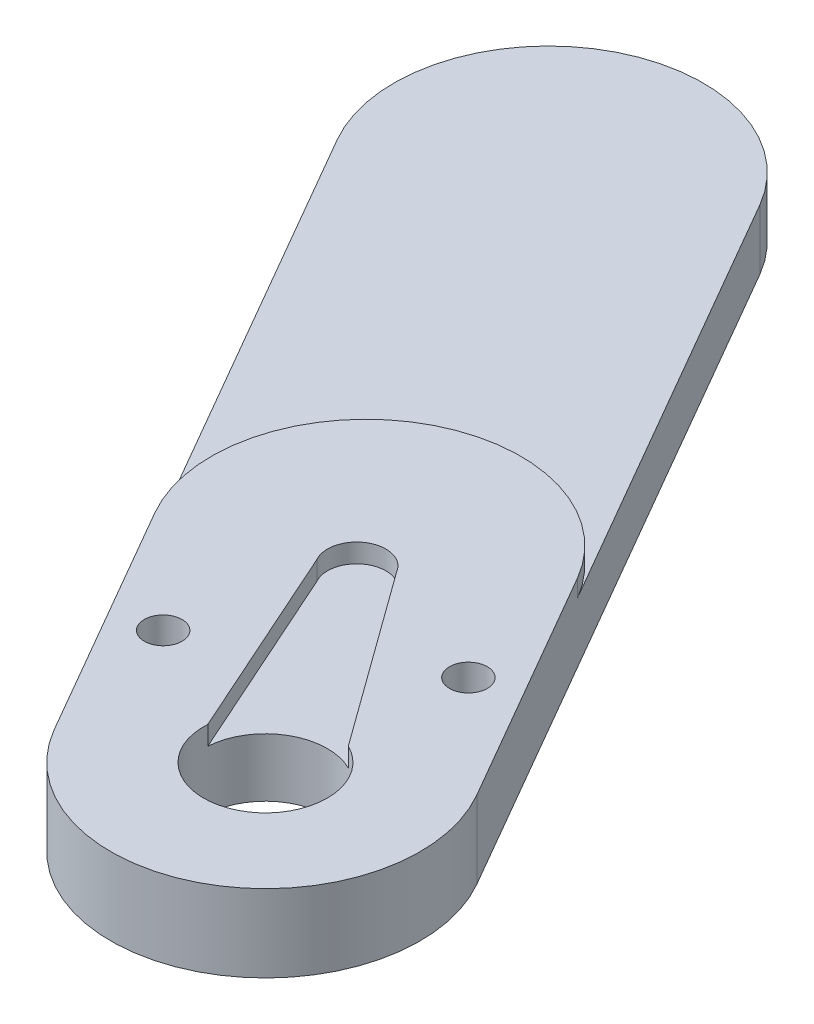
ISO-10303-21;
HEADER;
FILE_DESCRIPTION(('STEP AP214'),'2;1');
FILE_NAME('part.step','',(''),(''),'','','');
FILE_SCHEMA(('AUTOMOTIVE_DESIGN { 1 0 10303 214 1 1 1 1 }'));
ENDSEC;
DATA;
#1=APPLICATION_CONTEXT('core data for automotive mechanical design processes');
#2=APPLICATION_PROTOCOL_DEFINITION('international standard','automotive_design',2000,#1);
#3=PRODUCT_CONTEXT('',#1,'mechanical');
#4=PRODUCT('Part','Part','',(#3));
#5=PRODUCT_RELATED_PRODUCT_CATEGORY('part','',(#4));
#6=PRODUCT_DEFINITION_FORMATION('','',#4);
#7=PRODUCT_DEFINITION_CONTEXT('part definition',#1,'design');
#8=PRODUCT_DEFINITION('design','',#6,#7);
#9=PRODUCT_DEFINITION_SHAPE('','',#8);
#10=(LENGTH_UNIT() NAMED_UNIT(*) SI_UNIT(.MILLI.,.METRE.));
#11=(NAMED_UNIT(*) PLANE_ANGLE_UNIT() SI_UNIT($,.RADIAN.));
#12=(NAMED_UNIT(*) SI_UNIT($,.STERADIAN.) SOLID_ANGLE_UNIT());
#13=UNCERTAINTY_MEASURE_WITH_UNIT(LENGTH_MEASURE(1.E-05),#10,'distance_accuracy_value','');
#14=(GEOMETRIC_REPRESENTATION_CONTEXT(3) GLOBAL_UNCERTAINTY_ASSIGNED_CONTEXT((#13)) GLOBAL_UNIT_ASSIGNED_CONTEXT((#10,
#11,#12)) REPRESENTATION_CONTEXT('',''));
#15=CARTESIAN_POINT('',(0.,0.,0.));
#16=DIRECTION('',(0.,0.,1.));
#17=DIRECTION('',(1.,0.,0.));
#18=AXIS2_PLACEMENT_3D('',#15,#16,#17);
#19=CARTESIAN_POINT('',(59.654169994804,-70.1,-40.43616371386));
#20=DIRECTION('',(0.,1.,0.));
#21=DIRECTION('',(1.,0.,0.));
#22=AXIS2_PLACEMENT_3D('',#19,#20,#21);
#23=PLANE('',#22);
#24=CARTESIAN_POINT('',(63.,-70.1,-34.64101615137));
#25=DIRECTION('',(0.,1.,0.));
#26=DIRECTION('',(-0.50000000000019,0.,-0.866025403784329));
#27=AXIS2_PLACEMENT_3D('',#24,#25,#26);
#28=CIRCLE('',#27,3.6);
#29=CARTESIAN_POINT('',(64.591871397493,-70.1,-37.86993941677));
#30=VERTEX_POINT('',#29);
#31=CARTESIAN_POINT('',(61.2,-70.1,-37.758707605));
#32=VERTEX_POINT('',#31);
#33=EDGE_CURVE('E44',#30,#32,#28,.T.);
#34=ORIENTED_EDGE('',*,*,#33,.F.);
#35=DIRECTION('',(0.586459175781039,0.,0.809978786847054));
#36=VECTOR('',#35,1.);
#37=CARTESIAN_POINT('',(57.222243186434,-70.1,-48.04838450625));
#38=LINE('',#37,#36);
#39=CARTESIAN_POINT('',(57.222243186434,-70.1,-48.04838450625));
#40=VERTEX_POINT('',#39);
#41=EDGE_CURVE('E25',#40,#30,#38,.T.);
#42=ORIENTED_EDGE('',*,*,#41,.F.);
#43=CARTESIAN_POINT('',(55.75,-70.1,-47.19838450625));
#44=DIRECTION('',(0.,1.,0.));
#45=DIRECTION('',(0.866025403784329,0.,-0.50000000000019));
#46=AXIS2_PLACEMENT_3D('',#43,#44,#45);
#47=CIRCLE('',#46,1.7);
#48=CARTESIAN_POINT('',(54.277756813566,-70.1,-46.34838450625));
#49=VERTEX_POINT('',#48);
#50=EDGE_CURVE('E244',#40,#49,#47,.T.);
#51=ORIENTED_EDGE('',*,*,#50,.T.);
#52=DIRECTION('',(-0.408232618045233,0.,-0.912877937932522));
#53=VECTOR('',#52,1.);
#54=CARTESIAN_POINT('',(60.22871870789,-70.1,-33.04101615137));
#55=LINE('',#54,#53);
#56=CARTESIAN_POINT('',(59.407734726546,-70.1,-34.87687671429));
#57=VERTEX_POINT('',#56);
#58=EDGE_CURVE('E241',#57,#49,#55,.T.);
#59=ORIENTED_EDGE('',*,*,#58,.F.);
#60=CARTESIAN_POINT('',(63.,-70.1,-34.64101615137));
#61=DIRECTION('',(0.,1.,0.));
#62=DIRECTION('',(-0.50000000000019,0.,-0.866025403784329));
#63=AXIS2_PLACEMENT_3D('',#60,#61,#62);
#64=CIRCLE('',#63,3.6);
#65=EDGE_CURVE('E254',#32,#57,#64,.T.);
#66=ORIENTED_EDGE('',*,*,#65,.F.);
#67=EDGE_LOOP('',(#34,#42,#51,#59,#66));
#68=FACE_BOUND('',#67,.T.);
#69=ADVANCED_FACE('F16',(#68),#23,.T.);
#70=CARTESIAN_POINT('',(64.629165124599,-73.7,-44.81921938165));
#71=DIRECTION('',(0.,-1.,0.));
#72=DIRECTION('',(-0.50000000000019,0.,-0.866025403784329));
#73=AXIS2_PLACEMENT_3D('',#70,#71,#72);
#74=CYLINDRICAL_SURFACE('',#73,1.1);
#75=DIRECTION('',(0.,1.,0.));
#76=VECTOR('',#75,1.);
#77=CARTESIAN_POINT('',(64.079165124599,-73.7,-45.77184732581));
#78=LINE('',#77,#76);
#79=CARTESIAN_POINT('',(64.079165124599,-73.5,-45.77184732581));
#80=VERTEX_POINT('',#79);
#81=CARTESIAN_POINT('',(64.079165124599,-69.,-45.77184732581));
#82=VERTEX_POINT('',#81);
#83=EDGE_CURVE('E11',#80,#82,#78,.T.);
#84=ORIENTED_EDGE('',*,*,#83,.T.);
#85=CARTESIAN_POINT('',(64.629165124599,-69.,-44.81921938165));
#86=DIRECTION('',(0.,1.,0.));
#87=DIRECTION('',(-0.50000000000019,0.,-0.866025403784329));
#88=AXIS2_PLACEMENT_3D('',#85,#86,#87);
#89=CIRCLE('',#88,1.1);
#90=EDGE_CURVE('E194',#82,#82,#89,.T.);
#91=ORIENTED_EDGE('',*,*,#90,.T.);
#92=ORIENTED_EDGE('',*,*,#83,.F.);
#93=CARTESIAN_POINT('',(64.629165124599,-73.5,-44.81921938165));
#94=DIRECTION('',(0.,1.,0.));
#95=DIRECTION('',(-0.50000000000019,0.,-0.866025403784329));
#96=AXIS2_PLACEMENT_3D('',#93,#94,#95);
#97=CIRCLE('',#96,1.1);
#98=EDGE_CURVE('E228',#80,#80,#97,.T.);
#99=ORIENTED_EDGE('',*,*,#98,.F.);
#100=EDGE_LOOP('',(#84,#91,#92,#99));
#101=FACE_BOUND('',#100,.T.);
#102=ADVANCED_FACE('F428',(#101),#74,.F.);
#103=CARTESIAN_POINT('',(57.222243186434,-70.1,-48.04838450625));
#104=DIRECTION('',(-0.809978786847054,0.,0.586459175781039));
#105=DIRECTION('',(0.,1.,0.));
#106=AXIS2_PLACEMENT_3D('',#103,#104,#105);
#107=PLANE('',#106);
#108=DIRECTION('',(0.,-1.,0.));
#109=VECTOR('',#108,1.);
#110=CARTESIAN_POINT('',(64.591871397493,-73.6,-37.86993941677));
#111=LINE('',#110,#109);
#112=CARTESIAN_POINT('',(64.591871397493,-69.,-37.86993941677));
#113=VERTEX_POINT('',#112);
#114=EDGE_CURVE('E256',#113,#30,#111,.T.);
#115=ORIENTED_EDGE('',*,*,#114,.F.);
#116=DIRECTION('',(-0.586459175781039,0.,-0.809978786847054));
#117=VECTOR('',#116,1.);
#118=CARTESIAN_POINT('',(59.066823878882,-69.,-45.50077114591));
#119=LINE('',#118,#117);
#120=CARTESIAN_POINT('',(57.222243186434,-69.,-48.04838450625));
#121=VERTEX_POINT('',#120);
#122=EDGE_CURVE('E186',#113,#121,#119,.T.);
#123=ORIENTED_EDGE('',*,*,#122,.T.);
#124=DIRECTION('',(0.,1.,0.));
#125=VECTOR('',#124,1.);
#126=CARTESIAN_POINT('',(57.222243186434,-70.1,-48.04838450625));
#127=LINE('',#126,#125);
#128=EDGE_CURVE('E248',#40,#121,#127,.T.);
#129=ORIENTED_EDGE('',*,*,#128,.F.);
#130=ORIENTED_EDGE('',*,*,#41,.T.);
#131=EDGE_LOOP('',(#115,#123,#129,#130));
#132=FACE_BOUND('',#131,.T.);
#133=ADVANCED_FACE('F18',(#132),#107,.T.);
#134=CARTESIAN_POINT('',(63.,-73.6,-34.64101615137));
#135=DIRECTION('',(0.,-1.,0.));
#136=DIRECTION('',(-0.50000000000019,0.,-0.866025403784329));
#137=AXIS2_PLACEMENT_3D('',#134,#135,#136);
#138=CYLINDRICAL_SURFACE('',#137,3.6);
#139=DIRECTION('',(0.,1.,0.));
#140=VECTOR('',#139,1.);
#141=CARTESIAN_POINT('',(61.2,-73.6,-37.758707605));
#142=LINE('',#141,#140);
#143=CARTESIAN_POINT('',(61.2,-73.5,-37.758707605));
#144=VERTEX_POINT('',#143);
#145=EDGE_CURVE('E253',#144,#32,#142,.T.);
#146=ORIENTED_EDGE('',*,*,#145,.T.);
#147=ORIENTED_EDGE('',*,*,#65,.T.);
#148=DIRECTION('',(0.,-1.,0.));
#149=VECTOR('',#148,1.);
#150=CARTESIAN_POINT('',(59.407734726546,-73.6,-34.87687671429));
#151=LINE('',#150,#149);
#152=CARTESIAN_POINT('',(59.407734726546,-69.,-34.87687671429));
#153=VERTEX_POINT('',#152);
#154=EDGE_CURVE('E236',#153,#57,#151,.T.);
#155=ORIENTED_EDGE('',*,*,#154,.F.);
#156=CARTESIAN_POINT('',(63.,-69.,-34.64101615137));
#157=DIRECTION('',(0.,1.,0.));
#158=DIRECTION('',(-0.50000000000019,0.,-0.866025403784329));
#159=AXIS2_PLACEMENT_3D('',#156,#157,#158);
#160=CIRCLE('',#159,3.6);
#161=EDGE_CURVE('E189',#153,#113,#160,.T.);
#162=ORIENTED_EDGE('',*,*,#161,.T.);
#163=ORIENTED_EDGE('',*,*,#114,.T.);
#164=ORIENTED_EDGE('',*,*,#33,.T.);
#165=ORIENTED_EDGE('',*,*,#145,.F.);
#166=CARTESIAN_POINT('',(63.,-73.5,-34.64101615137));
#167=DIRECTION('',(0.,1.,0.));
#168=DIRECTION('',(-0.50000000000019,0.,-0.866025403784329));
#169=AXIS2_PLACEMENT_3D('',#166,#167,#168);
#170=CIRCLE('',#169,3.6);
#171=EDGE_CURVE('E223',#144,#144,#170,.T.);
#172=ORIENTED_EDGE('',*,*,#171,.F.);
#173=EDGE_LOOP('',(#146,#147,#155,#162,#163,#164,#165,#172));
#174=FACE_BOUND('',#173,.T.);
#175=ADVANCED_FACE('F461',(#174),#138,.F.);
#176=CARTESIAN_POINT('',(55.75,-70.1,-47.19838450625));
#177=DIRECTION('',(0.,-1.,0.));
#178=DIRECTION('',(-0.50000000000019,0.,-0.866025403784329));
#179=AXIS2_PLACEMENT_3D('',#176,#177,#178);
#180=CYLINDRICAL_SURFACE('',#179,1.7);
#181=CARTESIAN_POINT('',(55.75,-69.,-47.19838450625));
#182=DIRECTION('',(0.,1.,0.));
#183=DIRECTION('',(-0.50000000000019,0.,-0.866025403784329));
#184=AXIS2_PLACEMENT_3D('',#181,#182,#183);
#185=CIRCLE('',#184,1.7);
#186=CARTESIAN_POINT('',(54.277756813566,-69.,-46.34838450625));
#187=VERTEX_POINT('',#186);
#188=EDGE_CURVE('E184',#121,#187,#185,.T.);
#189=ORIENTED_EDGE('',*,*,#188,.T.);
#190=DIRECTION('',(0.,1.,0.));
#191=VECTOR('',#190,1.);
#192=CARTESIAN_POINT('',(54.277756813566,-70.1,-46.34838450625));
#193=LINE('',#192,#191);
#194=EDGE_CURVE('E232',#49,#187,#193,.T.);
#195=ORIENTED_EDGE('',*,*,#194,.F.);
#196=ORIENTED_EDGE('',*,*,#50,.F.);
#197=ORIENTED_EDGE('',*,*,#128,.T.);
#198=EDGE_LOOP('',(#189,#195,#196,#197));
#199=FACE_BOUND('',#198,.T.);
#200=ADVANCED_FACE('F445',(#199),#180,.F.);
#201=CARTESIAN_POINT('',(60.22871870789,-70.1,-33.04101615137));
#202=DIRECTION('',(0.912877937932522,0.,-0.408232618045233));
#203=DIRECTION('',(0.,-1.,0.));
#204=AXIS2_PLACEMENT_3D('',#201,#202,#203);
#205=PLANE('',#204);
#206=ORIENTED_EDGE('',*,*,#194,.T.);
#207=DIRECTION('',(0.408232618045233,0.,0.912877937932522));
#208=VECTOR('',#207,1.);
#209=CARTESIAN_POINT('',(58.537245303574,-69.,-36.82343990965));
#210=LINE('',#209,#208);
#211=EDGE_CURVE('E191',#187,#153,#210,.T.);
#212=ORIENTED_EDGE('',*,*,#211,.T.);
#213=ORIENTED_EDGE('',*,*,#154,.T.);
#214=ORIENTED_EDGE('',*,*,#58,.T.);
#215=EDGE_LOOP('',(#206,#212,#213,#214));
#216=FACE_BOUND('',#215,.T.);
#217=ADVANCED_FACE('F437',(#216),#205,.T.);
#218=CARTESIAN_POINT('',(53.370834875401,-73.7,-38.31921938165));
#219=DIRECTION('',(0.,-1.,0.));
#220=DIRECTION('',(-0.50000000000019,0.,-0.866025403784329));
#221=AXIS2_PLACEMENT_3D('',#218,#219,#220);
#222=CYLINDRICAL_SURFACE('',#221,1.1);
#223=DIRECTION('',(0.,1.,0.));
#224=VECTOR('',#223,1.);
#225=CARTESIAN_POINT('',(52.820834875401,-73.7,-39.27184732581));
#226=LINE('',#225,#224);
#227=CARTESIAN_POINT('',(52.820834875401,-73.5,-39.27184732581));
#228=VERTEX_POINT('',#227);
#229=CARTESIAN_POINT('',(52.820834875401,-69.,-39.27184732581));
#230=VERTEX_POINT('',#229);
#231=EDGE_CURVE('E233',#228,#230,#226,.T.);
#232=ORIENTED_EDGE('',*,*,#231,.T.);
#233=CARTESIAN_POINT('',(53.370834875401,-69.,-38.31921938165));
#234=DIRECTION('',(0.,1.,0.));
#235=DIRECTION('',(-0.50000000000019,0.,-0.866025403784329));
#236=AXIS2_PLACEMENT_3D('',#233,#234,#235);
#237=CIRCLE('',#236,1.1);
#238=EDGE_CURVE('E179',#230,#230,#237,.T.);
#239=ORIENTED_EDGE('',*,*,#238,.T.);
#240=ORIENTED_EDGE('',*,*,#231,.F.);
#241=CARTESIAN_POINT('',(53.370834875401,-73.5,-38.31921938165));
#242=DIRECTION('',(0.,1.,0.));
#243=DIRECTION('',(-0.50000000000019,0.,-0.866025403784329));
#244=AXIS2_PLACEMENT_3D('',#241,#242,#243);
#245=CIRCLE('',#244,1.1);
#246=EDGE_CURVE('E222',#228,#228,#245,.T.);
#247=ORIENTED_EDGE('',*,*,#246,.F.);
#248=EDGE_LOOP('',(#232,#239,#240,#247));
#249=FACE_BOUND('',#248,.T.);
#250=ADVANCED_FACE('F442',(#249),#222,.F.);
#251=CARTESIAN_POINT('',(48.29422863406,-73.5,-78.11215932167));
#252=DIRECTION('',(-0.866025403784329,0.,0.50000000000019));
#253=DIRECTION('',(0.,1.,0.));
#254=AXIS2_PLACEMENT_3D('',#251,#252,#253);
#255=PLANE('',#254);
#256=DIRECTION('',(0.,1.,0.));
#257=VECTOR('',#256,1.);
#258=CARTESIAN_POINT('',(48.29422863406,-73.5,-78.11215932167));
#259=LINE('',#258,#257);
#260=CARTESIAN_POINT('',(48.29422863406,-73.5,-78.11215932167));
#261=VERTEX_POINT('',#260);
#262=CARTESIAN_POINT('',(48.29422863406,-70.,-78.11215932167));
#263=VERTEX_POINT('',#262);
#264=EDGE_CURVE('E211',#261,#263,#259,.T.);
#265=ORIENTED_EDGE('',*,*,#264,.T.);
#266=DIRECTION('',(0.50000000000019,0.,0.866025403784329));
#267=VECTOR('',#266,1.);
#268=CARTESIAN_POINT('',(48.29422863406,-70.,-78.11215932167));
#269=LINE('',#268,#267);
#270=CARTESIAN_POINT('',(62.79422863406,-70.,-52.99742261192));
#271=VERTEX_POINT('',#270);
#272=EDGE_CURVE('E202',#263,#271,#269,.T.);
#273=ORIENTED_EDGE('',*,*,#272,.T.);
#274=DIRECTION('',(0.,1.,0.));
#275=VECTOR('',#274,1.);
#276=CARTESIAN_POINT('',(62.79422863406,-70.,-52.99742261192));
#277=LINE('',#276,#275);
#278=CARTESIAN_POINT('',(62.79422863406,-69.,-52.99742261192));
#279=VERTEX_POINT('',#278);
#280=EDGE_CURVE('E149',#271,#279,#277,.T.);
#281=ORIENTED_EDGE('',*,*,#280,.T.);
#282=DIRECTION('',(0.50000000000019,0.,0.866025403784329));
#283=VECTOR('',#282,1.);
#284=CARTESIAN_POINT('',(62.79422863406,-69.,-52.99742261192));
#285=LINE('',#284,#283);
#286=CARTESIAN_POINT('',(70.79422863406,-69.,-39.14101615137));
#287=VERTEX_POINT('',#286);
#288=EDGE_CURVE('E142',#279,#287,#285,.T.);
#289=ORIENTED_EDGE('',*,*,#288,.T.);
#290=DIRECTION('',(0.,-1.,0.));
#291=VECTOR('',#290,1.);
#292=CARTESIAN_POINT('',(70.79422863406,-69.,-39.14101615137));
#293=LINE('',#292,#291);
#294=CARTESIAN_POINT('',(70.79422863406,-73.5,-39.14101615137));
#295=VERTEX_POINT('',#294);
#296=EDGE_CURVE('E148',#287,#295,#293,.T.);
#297=ORIENTED_EDGE('',*,*,#296,.T.);
#298=DIRECTION('',(0.50000000000019,0.,0.866025403784329));
#299=VECTOR('',#298,1.);
#300=CARTESIAN_POINT('',(48.29422863406,-73.5,-78.11215932167));
#301=LINE('',#300,#299);
#302=EDGE_CURVE('E217',#261,#295,#301,.T.);
#303=ORIENTED_EDGE('',*,*,#302,.F.);
#304=EDGE_LOOP('',(#265,#273,#281,#289,#297,#303));
#305=FACE_BOUND('',#304,.T.);
#306=ADVANCED_FACE('F145',(#305),#255,.F.);
#307=CARTESIAN_POINT('',(51.75,-73.5,-54.12658773652));
#308=DIRECTION('',(0.,1.,0.));
#309=DIRECTION('',(1.,0.,0.));
#310=AXIS2_PLACEMENT_3D('',#307,#308,#309);
#311=PLANE('',#310);
#312=ORIENTED_EDGE('',*,*,#98,.T.);
#313=EDGE_LOOP('',(#312));
#314=FACE_BOUND('',#313,.T.);
#315=ORIENTED_EDGE('',*,*,#171,.T.);
#316=EDGE_LOOP('',(#315));
#317=FACE_BOUND('',#316,.T.);
#318=ORIENTED_EDGE('',*,*,#246,.T.);
#319=EDGE_LOOP('',(#318));
#320=FACE_BOUND('',#319,.T.);
#321=DIRECTION('',(-0.50000000000019,0.,-0.866025403784329));
#322=VECTOR('',#321,1.);
#323=CARTESIAN_POINT('',(55.20577136594,-73.5,-30.14101615137));
#324=LINE('',#323,#322);
#325=CARTESIAN_POINT('',(55.20577136594,-73.5,-30.14101615137));
#326=VERTEX_POINT('',#325);
#327=CARTESIAN_POINT('',(32.70577136594,-73.5,-69.11215932167));
#328=VERTEX_POINT('',#327);
#329=EDGE_CURVE('E174',#326,#328,#324,.T.);
#330=ORIENTED_EDGE('',*,*,#329,.T.);
#331=CARTESIAN_POINT('',(40.5,-73.5,-73.61215932167));
#332=DIRECTION('',(0.,-1.,0.));
#333=DIRECTION('',(-0.866025403784329,0.,0.50000000000019));
#334=AXIS2_PLACEMENT_3D('',#331,#332,#333);
#335=CIRCLE('',#334,9.);
#336=EDGE_CURVE('E212',#328,#261,#335,.T.);
#337=ORIENTED_EDGE('',*,*,#336,.T.);
#338=ORIENTED_EDGE('',*,*,#302,.T.);
#339=CARTESIAN_POINT('',(63.,-73.5,-34.64101615137));
#340=DIRECTION('',(0.,-1.,0.));
#341=DIRECTION('',(-0.50000000000019,0.,-0.866025403784329));
#342=AXIS2_PLACEMENT_3D('',#339,#340,#341);
#343=CIRCLE('',#342,9.);
#344=EDGE_CURVE('E167',#295,#326,#343,.T.);
#345=ORIENTED_EDGE('',*,*,#344,.T.);
#346=EDGE_LOOP('',(#330,#337,#338,#345));
#347=FACE_BOUND('',#346,.T.);
#348=ADVANCED_FACE('F409',(#314,#317,#320,#347),#311,.F.);
#349=CARTESIAN_POINT('',(40.5,-73.5,-73.61215932167));
#350=DIRECTION('',(0.,-1.,0.));
#351=DIRECTION('',(-0.50000000000019,0.,-0.866025403784329));
#352=AXIS2_PLACEMENT_3D('',#349,#350,#351);
#353=CYLINDRICAL_SURFACE('',#352,9.);
#354=CARTESIAN_POINT('',(40.5,-70.,-73.61215932167));
#355=DIRECTION('',(0.,1.,0.));
#356=DIRECTION('',(0.866025403784329,0.,-0.50000000000019));
#357=AXIS2_PLACEMENT_3D('',#354,#355,#356);
#358=CIRCLE('',#357,9.);
#359=CARTESIAN_POINT('',(32.70577136594,-70.,-69.11215932167));
#360=VERTEX_POINT('',#359);
#361=EDGE_CURVE('E208',#263,#360,#358,.T.);
#362=ORIENTED_EDGE('',*,*,#361,.F.);
#363=ORIENTED_EDGE('',*,*,#264,.F.);
#364=ORIENTED_EDGE('',*,*,#336,.F.);
#365=DIRECTION('',(0.,1.,0.));
#366=VECTOR('',#365,1.);
#367=CARTESIAN_POINT('',(32.70577136594,-73.5,-69.11215932167));
#368=LINE('',#367,#366);
#369=EDGE_CURVE('E176',#328,#360,#368,.T.);
#370=ORIENTED_EDGE('',*,*,#369,.T.);
#371=EDGE_LOOP('',(#362,#363,#364,#370));
#372=FACE_BOUND('',#371,.T.);
#373=ADVANCED_FACE('F410',(#372),#353,.T.);
#374=CARTESIAN_POINT('',(51.75,-70.,-54.12658773652));
#375=DIRECTION('',(0.,1.,0.));
#376=DIRECTION('',(1.,0.,0.));
#377=AXIS2_PLACEMENT_3D('',#374,#375,#376);
#378=PLANE('',#377);
#379=ORIENTED_EDGE('',*,*,#272,.F.);
#380=ORIENTED_EDGE('',*,*,#361,.T.);
#381=DIRECTION('',(-0.50000000000019,0.,-0.866025403784329));
#382=VECTOR('',#381,1.);
#383=CARTESIAN_POINT('',(55.20577136594,-70.,-30.14101615137));
#384=LINE('',#383,#382);
#385=CARTESIAN_POINT('',(47.20577136594,-70.,-43.99742261192));
#386=VERTEX_POINT('',#385);
#387=EDGE_CURVE('E379',#386,#360,#384,.T.);
#388=ORIENTED_EDGE('',*,*,#387,.F.);
#389=CARTESIAN_POINT('',(55.,-70.,-48.49742261192));
#390=DIRECTION('',(0.,-1.,0.));
#391=DIRECTION('',(-0.866025403784329,0.,0.50000000000019));
#392=AXIS2_PLACEMENT_3D('',#389,#390,#391);
#393=CIRCLE('',#392,9.);
#394=EDGE_CURVE('E203',#386,#271,#393,.T.);
#395=ORIENTED_EDGE('',*,*,#394,.T.);
#396=EDGE_LOOP('',(#379,#380,#388,#395));
#397=FACE_BOUND('',#396,.T.);
#398=ADVANCED_FACE('F415',(#397),#378,.T.);
#399=CARTESIAN_POINT('',(55.,-70.,-48.49742261192));
#400=DIRECTION('',(0.,-1.,0.));
#401=DIRECTION('',(-0.50000000000019,0.,-0.866025403784329));
#402=AXIS2_PLACEMENT_3D('',#399,#400,#401);
#403=CYLINDRICAL_SURFACE('',#402,9.);
#404=CARTESIAN_POINT('',(55.,-69.,-48.49742261192));
#405=DIRECTION('',(0.,1.,0.));
#406=DIRECTION('',(0.866025403784329,0.,-0.50000000000019));
#407=AXIS2_PLACEMENT_3D('',#404,#405,#406);
#408=CIRCLE('',#407,9.);
#409=CARTESIAN_POINT('',(47.20577136594,-69.,-43.99742261192));
#410=VERTEX_POINT('',#409);
#411=EDGE_CURVE('E153',#279,#410,#408,.T.);
#412=ORIENTED_EDGE('',*,*,#411,.F.);
#413=ORIENTED_EDGE('',*,*,#280,.F.);
#414=ORIENTED_EDGE('',*,*,#394,.F.);
#415=DIRECTION('',(0.,1.,0.));
#416=VECTOR('',#415,1.);
#417=CARTESIAN_POINT('',(47.20577136594,-70.,-43.99742261192));
#418=LINE('',#417,#416);
#419=EDGE_CURVE('E391',#386,#410,#418,.T.);
#420=ORIENTED_EDGE('',*,*,#419,.T.);
#421=EDGE_LOOP('',(#412,#413,#414,#420));
#422=FACE_BOUND('',#421,.T.);
#423=ADVANCED_FACE('F412',(#422),#403,.T.);
#424=CARTESIAN_POINT('',(59.,-69.,-41.56921938165));
#425=DIRECTION('',(0.,1.,0.));
#426=DIRECTION('',(1.,0.,0.));
#427=AXIS2_PLACEMENT_3D('',#424,#425,#426);
#428=PLANE('',#427);
#429=ORIENTED_EDGE('',*,*,#90,.F.);
#430=EDGE_LOOP('',(#429));
#431=FACE_BOUND('',#430,.T.);
#432=ORIENTED_EDGE('',*,*,#188,.F.);
#433=ORIENTED_EDGE('',*,*,#122,.F.);
#434=ORIENTED_EDGE('',*,*,#161,.F.);
#435=ORIENTED_EDGE('',*,*,#211,.F.);
#436=EDGE_LOOP('',(#432,#433,#434,#435));
#437=FACE_BOUND('',#436,.T.);
#438=ORIENTED_EDGE('',*,*,#238,.F.);
#439=EDGE_LOOP('',(#438));
#440=FACE_BOUND('',#439,.T.);
#441=CARTESIAN_POINT('',(63.,-69.,-34.64101615137));
#442=DIRECTION('',(0.,-1.,0.));
#443=DIRECTION('',(-0.50000000000019,0.,-0.866025403784329));
#444=AXIS2_PLACEMENT_3D('',#441,#442,#443);
#445=CIRCLE('',#444,9.);
#446=CARTESIAN_POINT('',(55.20577136594,-69.,-30.14101615137));
#447=VERTEX_POINT('',#446);
#448=EDGE_CURVE('E152',#287,#447,#445,.T.);
#449=ORIENTED_EDGE('',*,*,#448,.F.);
#450=ORIENTED_EDGE('',*,*,#288,.F.);
#451=ORIENTED_EDGE('',*,*,#411,.T.);
#452=DIRECTION('',(-0.50000000000019,0.,-0.866025403784329));
#453=VECTOR('',#452,1.);
#454=CARTESIAN_POINT('',(55.20577136594,-69.,-30.14101615137));
#455=LINE('',#454,#453);
#456=EDGE_CURVE('E157',#447,#410,#455,.T.);
#457=ORIENTED_EDGE('',*,*,#456,.F.);
#458=EDGE_LOOP('',(#449,#450,#451,#457));
#459=FACE_BOUND('',#458,.T.);
#460=ADVANCED_FACE('F160',(#431,#437,#440,#459),#428,.T.);
#461=CARTESIAN_POINT('',(63.,-73.5,-34.64101615137));
#462=DIRECTION('',(0.,-1.,0.));
#463=DIRECTION('',(-0.50000000000019,0.,-0.866025403784329));
#464=AXIS2_PLACEMENT_3D('',#461,#462,#463);
#465=CYLINDRICAL_SURFACE('',#464,9.);
#466=ORIENTED_EDGE('',*,*,#344,.F.);
#467=ORIENTED_EDGE('',*,*,#296,.F.);
#468=ORIENTED_EDGE('',*,*,#448,.T.);
#469=DIRECTION('',(0.,-1.,0.));
#470=VECTOR('',#469,1.);
#471=CARTESIAN_POINT('',(55.20577136594,-69.,-30.14101615137));
#472=LINE('',#471,#470);
#473=EDGE_CURVE('E398',#447,#326,#472,.T.);
#474=ORIENTED_EDGE('',*,*,#473,.T.);
#475=EDGE_LOOP('',(#466,#467,#468,#474));
#476=FACE_BOUND('',#475,.T.);
#477=ADVANCED_FACE('F164',(#476),#465,.T.);
#478=CARTESIAN_POINT('',(55.20577136594,-73.5,-30.14101615137));
#479=DIRECTION('',(0.866025403784329,0.,-0.50000000000019));
#480=DIRECTION('',(0.,-1.,0.));
#481=AXIS2_PLACEMENT_3D('',#478,#479,#480);
#482=PLANE('',#481);
#483=ORIENTED_EDGE('',*,*,#473,.F.);
#484=ORIENTED_EDGE('',*,*,#456,.T.);
#485=ORIENTED_EDGE('',*,*,#419,.F.);
#486=ORIENTED_EDGE('',*,*,#387,.T.);
#487=ORIENTED_EDGE('',*,*,#369,.F.);
#488=ORIENTED_EDGE('',*,*,#329,.F.);
#489=EDGE_LOOP('',(#483,#484,#485,#486,#487,#488));
#490=FACE_BOUND('',#489,.T.);
#491=ADVANCED_FACE('F401',(#490),#482,.F.);
#492=CLOSED_SHELL('',(#69,#102,#133,#175,#200,#217,#250,#306,#348,#373,#398,#423,#460,#477,#491));
#493=MANIFOLD_SOLID_BREP('B1',#492);
#494=ADVANCED_BREP_SHAPE_REPRESENTATION('',(#18,#493),#14);
#495=SHAPE_DEFINITION_REPRESENTATION(#9,#494);
ENDSEC;
END-ISO-10303-21;
